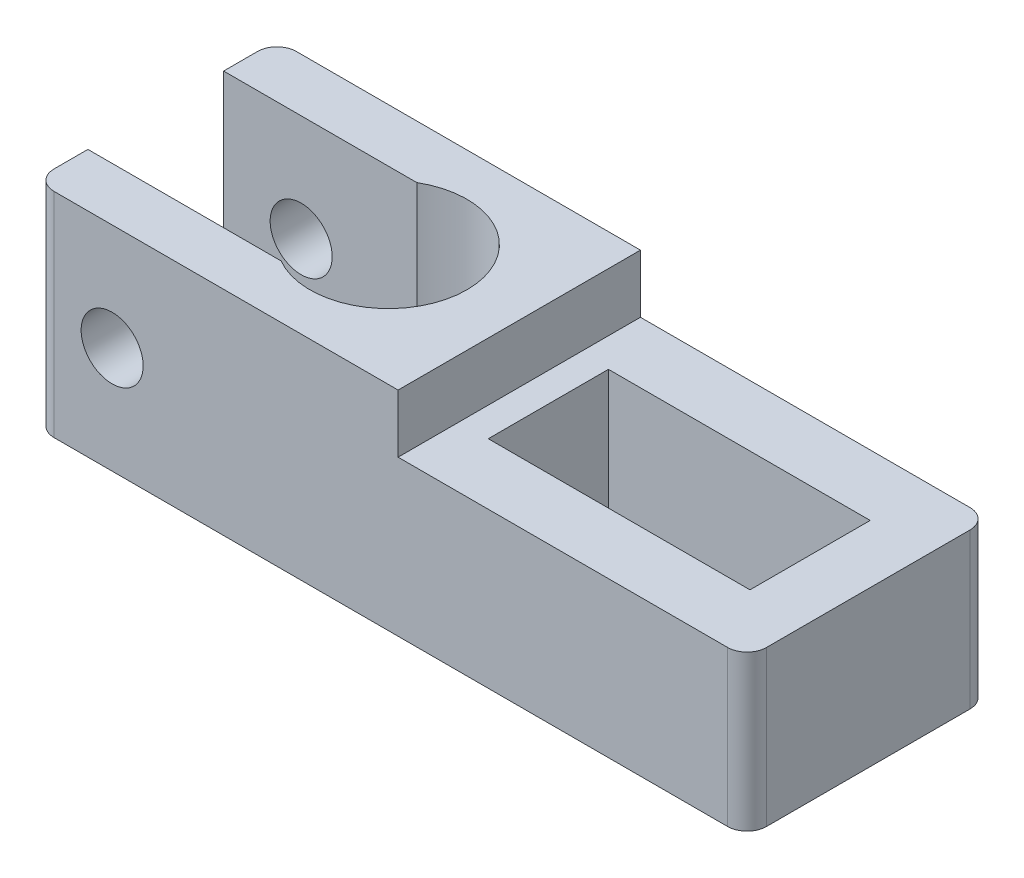
ISO-10303-21;
HEADER;
FILE_DESCRIPTION(('STEP AP214'),'2;1');
FILE_NAME('part.step','',(''),(''),'','','');
FILE_SCHEMA(('AUTOMOTIVE_DESIGN { 1 0 10303 214 1 1 1 1 }'));
ENDSEC;
DATA;
#1=APPLICATION_CONTEXT('core data for automotive mechanical design processes');
#2=APPLICATION_PROTOCOL_DEFINITION('international standard','automotive_design',2000,#1);
#3=PRODUCT_CONTEXT('',#1,'mechanical');
#4=PRODUCT('Part','Part','',(#3));
#5=PRODUCT_RELATED_PRODUCT_CATEGORY('part','',(#4));
#6=PRODUCT_DEFINITION_FORMATION('','',#4);
#7=PRODUCT_DEFINITION_CONTEXT('part definition',#1,'design');
#8=PRODUCT_DEFINITION('design','',#6,#7);
#9=PRODUCT_DEFINITION_SHAPE('','',#8);
#10=(LENGTH_UNIT() NAMED_UNIT(*) SI_UNIT(.MILLI.,.METRE.));
#11=(NAMED_UNIT(*) PLANE_ANGLE_UNIT() SI_UNIT($,.RADIAN.));
#12=(NAMED_UNIT(*) SI_UNIT($,.STERADIAN.) SOLID_ANGLE_UNIT());
#13=UNCERTAINTY_MEASURE_WITH_UNIT(LENGTH_MEASURE(1.E-05),#10,'distance_accuracy_value','');
#14=(GEOMETRIC_REPRESENTATION_CONTEXT(3) GLOBAL_UNCERTAINTY_ASSIGNED_CONTEXT((#13)) GLOBAL_UNIT_ASSIGNED_CONTEXT((#10,
#11,#12)) REPRESENTATION_CONTEXT('',''));
#15=CARTESIAN_POINT('',(0.,0.,0.));
#16=DIRECTION('',(0.,0.,1.));
#17=DIRECTION('',(1.,0.,0.));
#18=AXIS2_PLACEMENT_3D('',#15,#16,#17);
#19=CARTESIAN_POINT('',(0.,11.,3.1));
#20=DIRECTION('',(0.,0.,1.));
#21=DIRECTION('',(1.,0.,0.));
#22=AXIS2_PLACEMENT_3D('',#19,#20,#21);
#23=PLANE('',#22);
#24=DIRECTION('',(0.,-1.,0.));
#25=VECTOR('',#24,1.);
#26=CARTESIAN_POINT('',(8.25,11.,3.1));
#27=LINE('',#26,#25);
#28=CARTESIAN_POINT('',(8.25,8.,3.1));
#29=VERTEX_POINT('',#28);
#30=CARTESIAN_POINT('',(8.25,0.,3.1));
#31=VERTEX_POINT('',#30);
#32=EDGE_CURVE('E237',#29,#31,#27,.T.);
#33=ORIENTED_EDGE('',*,*,#32,.F.);
#34=DIRECTION('',(1.,0.,0.));
#35=VECTOR('',#34,1.);
#36=CARTESIAN_POINT('',(0.,8.,3.1));
#37=LINE('',#36,#35);
#38=CARTESIAN_POINT('',(21.75,8.,3.1));
#39=VERTEX_POINT('',#38);
#40=EDGE_CURVE('E312',#29,#39,#37,.T.);
#41=ORIENTED_EDGE('',*,*,#40,.T.);
#42=DIRECTION('',(0.,-1.,0.));
#43=VECTOR('',#42,1.);
#44=CARTESIAN_POINT('',(21.75,11.,3.1));
#45=LINE('',#44,#43);
#46=CARTESIAN_POINT('',(21.75,0.,3.1));
#47=VERTEX_POINT('',#46);
#48=EDGE_CURVE('E230',#39,#47,#45,.T.);
#49=ORIENTED_EDGE('',*,*,#48,.T.);
#50=DIRECTION('',(-1.,0.,0.));
#51=VECTOR('',#50,1.);
#52=CARTESIAN_POINT('',(0.,0.,3.1));
#53=LINE('',#52,#51);
#54=EDGE_CURVE('E217',#47,#31,#53,.T.);
#55=ORIENTED_EDGE('',*,*,#54,.T.);
#56=EDGE_LOOP('',(#33,#41,#49,#55));
#57=FACE_BOUND('',#56,.T.);
#58=ADVANCED_FACE('F35',(#57),#23,.F.);
#59=CARTESIAN_POINT('',(8.25,11.,0.));
#60=DIRECTION('',(-1.,0.,0.));
#61=DIRECTION('',(0.,0.,1.));
#62=AXIS2_PLACEMENT_3D('',#59,#60,#61);
#63=PLANE('',#62);
#64=DIRECTION('',(0.,-1.,0.));
#65=VECTOR('',#64,1.);
#66=CARTESIAN_POINT('',(8.25,11.,-3.1));
#67=LINE('',#66,#65);
#68=CARTESIAN_POINT('',(8.25,8.,-3.1));
#69=VERTEX_POINT('',#68);
#70=CARTESIAN_POINT('',(8.25,0.,-3.1));
#71=VERTEX_POINT('',#70);
#72=EDGE_CURVE('E235',#69,#71,#67,.T.);
#73=ORIENTED_EDGE('',*,*,#72,.F.);
#74=DIRECTION('',(0.,0.,1.));
#75=VECTOR('',#74,1.);
#76=CARTESIAN_POINT('',(8.25,8.,0.));
#77=LINE('',#76,#75);
#78=EDGE_CURVE('E309',#69,#29,#77,.T.);
#79=ORIENTED_EDGE('',*,*,#78,.T.);
#80=ORIENTED_EDGE('',*,*,#32,.T.);
#81=DIRECTION('',(0.,0.,-1.));
#82=VECTOR('',#81,1.);
#83=CARTESIAN_POINT('',(8.25,0.,0.));
#84=LINE('',#83,#82);
#85=EDGE_CURVE('E220',#31,#71,#84,.T.);
#86=ORIENTED_EDGE('',*,*,#85,.T.);
#87=EDGE_LOOP('',(#73,#79,#80,#86));
#88=FACE_BOUND('',#87,.T.);
#89=ADVANCED_FACE('F364',(#88),#63,.F.);
#90=CARTESIAN_POINT('',(0.,11.,-3.1));
#91=DIRECTION('',(0.,0.,1.));
#92=DIRECTION('',(1.,0.,0.));
#93=AXIS2_PLACEMENT_3D('',#90,#91,#92);
#94=PLANE('',#93);
#95=DIRECTION('',(1.,0.,0.));
#96=VECTOR('',#95,1.);
#97=CARTESIAN_POINT('',(0.,8.,-3.1));
#98=LINE('',#97,#96);
#99=CARTESIAN_POINT('',(21.75,8.,-3.1));
#100=VERTEX_POINT('',#99);
#101=EDGE_CURVE('E50',#69,#100,#98,.T.);
#102=ORIENTED_EDGE('',*,*,#101,.F.);
#103=ORIENTED_EDGE('',*,*,#72,.T.);
#104=DIRECTION('',(-1.,0.,0.));
#105=VECTOR('',#104,1.);
#106=CARTESIAN_POINT('',(0.,0.,-3.1));
#107=LINE('',#106,#105);
#108=CARTESIAN_POINT('',(21.75,0.,-3.1));
#109=VERTEX_POINT('',#108);
#110=EDGE_CURVE('E223',#109,#71,#107,.T.);
#111=ORIENTED_EDGE('',*,*,#110,.F.);
#112=DIRECTION('',(0.,-1.,0.));
#113=VECTOR('',#112,1.);
#114=CARTESIAN_POINT('',(21.75,11.,-3.1));
#115=LINE('',#114,#113);
#116=EDGE_CURVE('E232',#100,#109,#115,.T.);
#117=ORIENTED_EDGE('',*,*,#116,.F.);
#118=EDGE_LOOP('',(#102,#103,#111,#117));
#119=FACE_BOUND('',#118,.T.);
#120=ADVANCED_FACE('F370',(#119),#94,.T.);
#121=CARTESIAN_POINT('',(0.,11.,0.));
#122=DIRECTION('',(0.,-1.,0.));
#123=DIRECTION('',(0.,0.,-1.));
#124=AXIS2_PLACEMENT_3D('',#121,#122,#123);
#125=CYLINDRICAL_SURFACE('',#124,4.05);
#126=CARTESIAN_POINT('',(0.,0.,0.));
#127=DIRECTION('',(0.,1.,0.));
#128=DIRECTION('',(0.,0.,1.));
#129=AXIS2_PLACEMENT_3D('',#126,#127,#128);
#130=CIRCLE('',#129,4.05);
#131=CARTESIAN_POINT('',(-2.03776838723148,0.,3.5));
#132=VERTEX_POINT('',#131);
#133=CARTESIAN_POINT('',(-2.03776838723148,0.,-3.5));
#134=VERTEX_POINT('',#133);
#135=EDGE_CURVE('E196',#132,#134,#130,.T.);
#136=ORIENTED_EDGE('',*,*,#135,.F.);
#137=DIRECTION('',(0.,-1.,0.));
#138=VECTOR('',#137,1.);
#139=CARTESIAN_POINT('',(-2.03776838723148,11.,3.5));
#140=LINE('',#139,#138);
#141=CARTESIAN_POINT('',(-2.03776838723148,11.,3.5));
#142=VERTEX_POINT('',#141);
#143=EDGE_CURVE('E233',#142,#132,#140,.T.);
#144=ORIENTED_EDGE('',*,*,#143,.F.);
#145=CARTESIAN_POINT('',(0.,11.,0.));
#146=DIRECTION('',(0.,1.,0.));
#147=DIRECTION('',(0.,0.,1.));
#148=AXIS2_PLACEMENT_3D('',#145,#146,#147);
#149=CIRCLE('',#148,4.05);
#150=CARTESIAN_POINT('',(-2.03776838723148,11.,-3.5));
#151=VERTEX_POINT('',#150);
#152=EDGE_CURVE('E229',#142,#151,#149,.T.);
#153=ORIENTED_EDGE('',*,*,#152,.T.);
#154=DIRECTION('',(0.,-1.,0.));
#155=VECTOR('',#154,1.);
#156=CARTESIAN_POINT('',(-2.03776838723148,11.,-3.5));
#157=LINE('',#156,#155);
#158=EDGE_CURVE('E195',#151,#134,#157,.T.);
#159=ORIENTED_EDGE('',*,*,#158,.T.);
#160=EDGE_LOOP('',(#136,#144,#153,#159));
#161=FACE_BOUND('',#160,.T.);
#162=ADVANCED_FACE('F342',(#161),#125,.F.);
#163=CARTESIAN_POINT('',(0.,11.,3.5));
#164=DIRECTION('',(0.,0.,1.));
#165=DIRECTION('',(1.,0.,0.));
#166=AXIS2_PLACEMENT_3D('',#163,#164,#165);
#167=PLANE('',#166);
#168=CARTESIAN_POINT('',(-8.,5.5,3.5));
#169=DIRECTION('',(0.,0.,1.));
#170=DIRECTION('',(1.,0.,0.));
#171=AXIS2_PLACEMENT_3D('',#168,#169,#170);
#172=CIRCLE('',#171,1.6);
#173=CARTESIAN_POINT('',(-6.4,5.5,3.5));
#174=VERTEX_POINT('',#173);
#175=EDGE_CURVE('E200',#174,#174,#172,.T.);
#176=ORIENTED_EDGE('',*,*,#175,.T.);
#177=EDGE_LOOP('',(#176));
#178=FACE_BOUND('',#177,.T.);
#179=DIRECTION('',(-1.,0.,0.));
#180=VECTOR('',#179,1.);
#181=CARTESIAN_POINT('',(0.,0.,3.5));
#182=LINE('',#181,#180);
#183=CARTESIAN_POINT('',(-12.,0.,3.5));
#184=VERTEX_POINT('',#183);
#185=EDGE_CURVE('E199',#132,#184,#182,.T.);
#186=ORIENTED_EDGE('',*,*,#185,.T.);
#187=DIRECTION('',(0.,-1.,0.));
#188=VECTOR('',#187,1.);
#189=CARTESIAN_POINT('',(-12.,11.,3.5));
#190=LINE('',#189,#188);
#191=CARTESIAN_POINT('',(-12.,11.,3.5));
#192=VERTEX_POINT('',#191);
#193=EDGE_CURVE('E243',#192,#184,#190,.T.);
#194=ORIENTED_EDGE('',*,*,#193,.F.);
#195=DIRECTION('',(-1.,0.,0.));
#196=VECTOR('',#195,1.);
#197=CARTESIAN_POINT('',(0.,11.,3.5));
#198=LINE('',#197,#196);
#199=EDGE_CURVE('E324',#142,#192,#198,.T.);
#200=ORIENTED_EDGE('',*,*,#199,.F.);
#201=ORIENTED_EDGE('',*,*,#143,.T.);
#202=EDGE_LOOP('',(#186,#194,#200,#201));
#203=FACE_BOUND('',#202,.T.);
#204=ADVANCED_FACE('F337',(#178,#203),#167,.F.);
#205=CARTESIAN_POINT('',(-12.,11.,0.));
#206=DIRECTION('',(-1.,0.,0.));
#207=DIRECTION('',(0.,0.,1.));
#208=AXIS2_PLACEMENT_3D('',#205,#206,#207);
#209=PLANE('',#208);
#210=DIRECTION('',(0.,0.,-1.));
#211=VECTOR('',#210,1.);
#212=CARTESIAN_POINT('',(-12.,0.,0.));
#213=LINE('',#212,#211);
#214=CARTESIAN_POINT('',(-12.,0.,5.25));
#215=VERTEX_POINT('',#214);
#216=EDGE_CURVE('E203',#215,#184,#213,.T.);
#217=ORIENTED_EDGE('',*,*,#216,.F.);
#218=DIRECTION('',(0.,-1.,0.));
#219=VECTOR('',#218,1.);
#220=CARTESIAN_POINT('',(-12.,11.,5.25));
#221=LINE('',#220,#219);
#222=CARTESIAN_POINT('',(-12.,11.,5.25));
#223=VERTEX_POINT('',#222);
#224=EDGE_CURVE('E264',#215,#223,#221,.F.);
#225=ORIENTED_EDGE('',*,*,#224,.T.);
#226=DIRECTION('',(0.,0.,-1.));
#227=VECTOR('',#226,1.);
#228=CARTESIAN_POINT('',(-12.,11.,0.));
#229=LINE('',#228,#227);
#230=EDGE_CURVE('E190',#223,#192,#229,.T.);
#231=ORIENTED_EDGE('',*,*,#230,.T.);
#232=ORIENTED_EDGE('',*,*,#193,.T.);
#233=EDGE_LOOP('',(#217,#225,#231,#232));
#234=FACE_BOUND('',#233,.T.);
#235=ADVANCED_FACE('F329',(#234),#209,.T.);
#236=CARTESIAN_POINT('',(0.,11.,6.25));
#237=DIRECTION('',(0.,0.,1.));
#238=DIRECTION('',(1.,0.,0.));
#239=AXIS2_PLACEMENT_3D('',#236,#237,#238);
#240=PLANE('',#239);
#241=DIRECTION('',(1.,0.,0.));
#242=VECTOR('',#241,1.);
#243=CARTESIAN_POINT('',(24.75,8.,6.25));
#244=LINE('',#243,#242);
#245=CARTESIAN_POINT('',(6.75,8.,6.25));
#246=VERTEX_POINT('',#245);
#247=CARTESIAN_POINT('',(23.75,8.,6.25));
#248=VERTEX_POINT('',#247);
#249=EDGE_CURVE('E170',#246,#248,#244,.T.);
#250=ORIENTED_EDGE('',*,*,#249,.F.);
#251=DIRECTION('',(0.,-1.,0.));
#252=VECTOR('',#251,1.);
#253=CARTESIAN_POINT('',(6.75,11.,6.25));
#254=LINE('',#253,#252);
#255=CARTESIAN_POINT('',(6.75,11.,6.25));
#256=VERTEX_POINT('',#255);
#257=EDGE_CURVE('E299',#256,#246,#254,.T.);
#258=ORIENTED_EDGE('',*,*,#257,.F.);
#259=DIRECTION('',(-1.,0.,0.));
#260=VECTOR('',#259,1.);
#261=CARTESIAN_POINT('',(0.,11.,6.25));
#262=LINE('',#261,#260);
#263=CARTESIAN_POINT('',(-11.,11.,6.25));
#264=VERTEX_POINT('',#263);
#265=EDGE_CURVE('E178',#256,#264,#262,.T.);
#266=ORIENTED_EDGE('',*,*,#265,.T.);
#267=DIRECTION('',(0.,-1.,0.));
#268=VECTOR('',#267,1.);
#269=CARTESIAN_POINT('',(-11.,11.,6.25));
#270=LINE('',#269,#268);
#271=CARTESIAN_POINT('',(-11.,0.,6.25));
#272=VERTEX_POINT('',#271);
#273=EDGE_CURVE('E253',#264,#272,#270,.T.);
#274=ORIENTED_EDGE('',*,*,#273,.T.);
#275=DIRECTION('',(-1.,0.,0.));
#276=VECTOR('',#275,1.);
#277=CARTESIAN_POINT('',(0.,0.,6.25));
#278=LINE('',#277,#276);
#279=CARTESIAN_POINT('',(23.75,0.,6.25));
#280=VERTEX_POINT('',#279);
#281=EDGE_CURVE('E205',#280,#272,#278,.T.);
#282=ORIENTED_EDGE('',*,*,#281,.F.);
#283=DIRECTION('',(0.,-1.,0.));
#284=VECTOR('',#283,1.);
#285=CARTESIAN_POINT('',(23.75,11.,6.25));
#286=LINE('',#285,#284);
#287=EDGE_CURVE('E239',#280,#248,#286,.F.);
#288=ORIENTED_EDGE('',*,*,#287,.T.);
#289=EDGE_LOOP('',(#250,#258,#266,#274,#282,#288));
#290=FACE_BOUND('',#289,.T.);
#291=CARTESIAN_POINT('',(-8.,5.5,6.25));
#292=DIRECTION('',(0.,0.,1.));
#293=DIRECTION('',(1.,0.,0.));
#294=AXIS2_PLACEMENT_3D('',#291,#292,#293);
#295=CIRCLE('',#294,1.6);
#296=CARTESIAN_POINT('',(-6.4,5.5,6.25));
#297=VERTEX_POINT('',#296);
#298=EDGE_CURVE('E315',#297,#297,#295,.T.);
#299=ORIENTED_EDGE('',*,*,#298,.F.);
#300=EDGE_LOOP('',(#299));
#301=FACE_BOUND('',#300,.T.);
#302=ADVANCED_FACE('F387',(#290,#301),#240,.T.);
#303=CARTESIAN_POINT('',(24.75,11.,0.));
#304=DIRECTION('',(-1.,0.,0.));
#305=DIRECTION('',(0.,0.,1.));
#306=AXIS2_PLACEMENT_3D('',#303,#304,#305);
#307=PLANE('',#306);
#308=DIRECTION('',(0.,-1.,0.));
#309=VECTOR('',#308,1.);
#310=CARTESIAN_POINT('',(24.75,11.,-5.25));
#311=LINE('',#310,#309);
#312=CARTESIAN_POINT('',(24.75,0.,-5.25));
#313=VERTEX_POINT('',#312);
#314=CARTESIAN_POINT('',(24.75,8.,-5.25));
#315=VERTEX_POINT('',#314);
#316=EDGE_CURVE('E276',#313,#315,#311,.F.);
#317=ORIENTED_EDGE('',*,*,#316,.T.);
#318=DIRECTION('',(0.,0.,1.));
#319=VECTOR('',#318,1.);
#320=CARTESIAN_POINT('',(24.75,8.,-6.25));
#321=LINE('',#320,#319);
#322=CARTESIAN_POINT('',(24.75,8.,5.25));
#323=VERTEX_POINT('',#322);
#324=EDGE_CURVE('E57',#315,#323,#321,.T.);
#325=ORIENTED_EDGE('',*,*,#324,.T.);
#326=DIRECTION('',(0.,-1.,0.));
#327=VECTOR('',#326,1.);
#328=CARTESIAN_POINT('',(24.75,0.,5.25));
#329=LINE('',#328,#327);
#330=CARTESIAN_POINT('',(24.75,0.,5.25));
#331=VERTEX_POINT('',#330);
#332=EDGE_CURVE('E43',#323,#331,#329,.T.);
#333=ORIENTED_EDGE('',*,*,#332,.T.);
#334=DIRECTION('',(0.,0.,-1.));
#335=VECTOR('',#334,1.);
#336=CARTESIAN_POINT('',(24.75,0.,0.));
#337=LINE('',#336,#335);
#338=EDGE_CURVE('E209',#331,#313,#337,.T.);
#339=ORIENTED_EDGE('',*,*,#338,.T.);
#340=EDGE_LOOP('',(#317,#325,#333,#339));
#341=FACE_BOUND('',#340,.T.);
#342=ADVANCED_FACE('F281',(#341),#307,.F.);
#343=CARTESIAN_POINT('',(0.,11.,-6.25));
#344=DIRECTION('',(0.,0.,1.));
#345=DIRECTION('',(1.,0.,0.));
#346=AXIS2_PLACEMENT_3D('',#343,#344,#345);
#347=PLANE('',#346);
#348=CARTESIAN_POINT('',(-8.,5.5,-6.25));
#349=DIRECTION('',(0.,0.,1.));
#350=DIRECTION('',(1.,0.,0.));
#351=AXIS2_PLACEMENT_3D('',#348,#349,#350);
#352=CIRCLE('',#351,1.6);
#353=CARTESIAN_POINT('',(-6.4,5.5,-6.25));
#354=VERTEX_POINT('',#353);
#355=EDGE_CURVE('E250',#354,#354,#352,.T.);
#356=ORIENTED_EDGE('',*,*,#355,.T.);
#357=EDGE_LOOP('',(#356));
#358=FACE_BOUND('',#357,.T.);
#359=DIRECTION('',(0.,-1.,0.));
#360=VECTOR('',#359,1.);
#361=CARTESIAN_POINT('',(6.75,11.,-6.25));
#362=LINE('',#361,#360);
#363=CARTESIAN_POINT('',(6.75,11.,-6.25));
#364=VERTEX_POINT('',#363);
#365=CARTESIAN_POINT('',(6.75,8.,-6.25));
#366=VERTEX_POINT('',#365);
#367=EDGE_CURVE('E158',#364,#366,#362,.T.);
#368=ORIENTED_EDGE('',*,*,#367,.T.);
#369=DIRECTION('',(1.,0.,0.));
#370=VECTOR('',#369,1.);
#371=CARTESIAN_POINT('',(24.75,8.,-6.25));
#372=LINE('',#371,#370);
#373=CARTESIAN_POINT('',(23.75,8.,-6.25));
#374=VERTEX_POINT('',#373);
#375=EDGE_CURVE('E169',#366,#374,#372,.T.);
#376=ORIENTED_EDGE('',*,*,#375,.T.);
#377=DIRECTION('',(0.,-1.,0.));
#378=VECTOR('',#377,1.);
#379=CARTESIAN_POINT('',(23.75,11.,-6.25));
#380=LINE('',#379,#378);
#381=CARTESIAN_POINT('',(23.75,0.,-6.25));
#382=VERTEX_POINT('',#381);
#383=EDGE_CURVE('E273',#374,#382,#380,.T.);
#384=ORIENTED_EDGE('',*,*,#383,.T.);
#385=DIRECTION('',(-1.,0.,0.));
#386=VECTOR('',#385,1.);
#387=CARTESIAN_POINT('',(0.,0.,-6.25));
#388=LINE('',#387,#386);
#389=CARTESIAN_POINT('',(-11.,0.,-6.25));
#390=VERTEX_POINT('',#389);
#391=EDGE_CURVE('E212',#382,#390,#388,.T.);
#392=ORIENTED_EDGE('',*,*,#391,.T.);
#393=DIRECTION('',(0.,-1.,0.));
#394=VECTOR('',#393,1.);
#395=CARTESIAN_POINT('',(-11.,11.,-6.25));
#396=LINE('',#395,#394);
#397=CARTESIAN_POINT('',(-11.,11.,-6.25));
#398=VERTEX_POINT('',#397);
#399=EDGE_CURVE('E183',#390,#398,#396,.F.);
#400=ORIENTED_EDGE('',*,*,#399,.T.);
#401=DIRECTION('',(-1.,0.,0.));
#402=VECTOR('',#401,1.);
#403=CARTESIAN_POINT('',(0.,11.,-6.25));
#404=LINE('',#403,#402);
#405=EDGE_CURVE('E175',#364,#398,#404,.T.);
#406=ORIENTED_EDGE('',*,*,#405,.F.);
#407=EDGE_LOOP('',(#368,#376,#384,#392,#400,#406));
#408=FACE_BOUND('',#407,.T.);
#409=ADVANCED_FACE('F180',(#358,#408),#347,.F.);
#410=CARTESIAN_POINT('',(-12.,11.,-3.5));
#411=VERTEX_POINT('',#410);
#412=CARTESIAN_POINT('',(-12.,11.,-5.25));
#413=VERTEX_POINT('',#412);
#414=EDGE_CURVE('E185',#411,#413,#229,.T.);
#415=ORIENTED_EDGE('',*,*,#414,.T.);
#416=DIRECTION('',(0.,-1.,0.));
#417=VECTOR('',#416,1.);
#418=CARTESIAN_POINT('',(-12.,0.,-5.25));
#419=LINE('',#418,#417);
#420=CARTESIAN_POINT('',(-12.,0.,-5.25));
#421=VERTEX_POINT('',#420);
#422=EDGE_CURVE('E270',#413,#421,#419,.T.);
#423=ORIENTED_EDGE('',*,*,#422,.T.);
#424=CARTESIAN_POINT('',(-12.,0.,-3.5));
#425=VERTEX_POINT('',#424);
#426=EDGE_CURVE('E206',#425,#421,#213,.T.);
#427=ORIENTED_EDGE('',*,*,#426,.F.);
#428=DIRECTION('',(0.,-1.,0.));
#429=VECTOR('',#428,1.);
#430=CARTESIAN_POINT('',(-12.,11.,-3.5));
#431=LINE('',#430,#429);
#432=EDGE_CURVE('E241',#411,#425,#431,.T.);
#433=ORIENTED_EDGE('',*,*,#432,.F.);
#434=EDGE_LOOP('',(#415,#423,#427,#433));
#435=FACE_BOUND('',#434,.T.);
#436=ADVANCED_FACE('F348',(#435),#209,.T.);
#437=CARTESIAN_POINT('',(0.,11.,-3.5));
#438=DIRECTION('',(0.,0.,1.));
#439=DIRECTION('',(1.,0.,0.));
#440=AXIS2_PLACEMENT_3D('',#437,#438,#439);
#441=PLANE('',#440);
#442=CARTESIAN_POINT('',(-8.,5.5,-3.5));
#443=DIRECTION('',(0.,0.,1.));
#444=DIRECTION('',(1.,0.,0.));
#445=AXIS2_PLACEMENT_3D('',#442,#443,#444);
#446=CIRCLE('',#445,1.6);
#447=CARTESIAN_POINT('',(-6.4,5.5,-3.5));
#448=VERTEX_POINT('',#447);
#449=EDGE_CURVE('E247',#448,#448,#446,.T.);
#450=ORIENTED_EDGE('',*,*,#449,.F.);
#451=EDGE_LOOP('',(#450));
#452=FACE_BOUND('',#451,.T.);
#453=DIRECTION('',(-1.,0.,0.));
#454=VECTOR('',#453,1.);
#455=CARTESIAN_POINT('',(0.,0.,-3.5));
#456=LINE('',#455,#454);
#457=EDGE_CURVE('E214',#134,#425,#456,.T.);
#458=ORIENTED_EDGE('',*,*,#457,.F.);
#459=ORIENTED_EDGE('',*,*,#158,.F.);
#460=DIRECTION('',(-1.,0.,0.));
#461=VECTOR('',#460,1.);
#462=CARTESIAN_POINT('',(0.,11.,-3.5));
#463=LINE('',#462,#461);
#464=EDGE_CURVE('E188',#151,#411,#463,.T.);
#465=ORIENTED_EDGE('',*,*,#464,.T.);
#466=ORIENTED_EDGE('',*,*,#432,.T.);
#467=EDGE_LOOP('',(#458,#459,#465,#466));
#468=FACE_BOUND('',#467,.T.);
#469=ADVANCED_FACE('F344',(#452,#468),#441,.T.);
#470=CARTESIAN_POINT('',(21.75,11.,0.));
#471=DIRECTION('',(-1.,0.,0.));
#472=DIRECTION('',(0.,0.,1.));
#473=AXIS2_PLACEMENT_3D('',#470,#471,#472);
#474=PLANE('',#473);
#475=DIRECTION('',(0.,0.,1.));
#476=VECTOR('',#475,1.);
#477=CARTESIAN_POINT('',(21.75,8.,0.));
#478=LINE('',#477,#476);
#479=EDGE_CURVE('E306',#100,#39,#478,.T.);
#480=ORIENTED_EDGE('',*,*,#479,.F.);
#481=ORIENTED_EDGE('',*,*,#116,.T.);
#482=DIRECTION('',(0.,0.,-1.));
#483=VECTOR('',#482,1.);
#484=CARTESIAN_POINT('',(21.75,0.,0.));
#485=LINE('',#484,#483);
#486=EDGE_CURVE('E226',#47,#109,#485,.T.);
#487=ORIENTED_EDGE('',*,*,#486,.F.);
#488=ORIENTED_EDGE('',*,*,#48,.F.);
#489=EDGE_LOOP('',(#480,#481,#487,#488));
#490=FACE_BOUND('',#489,.T.);
#491=ADVANCED_FACE('F378',(#490),#474,.T.);
#492=CARTESIAN_POINT('',(0.,11.,0.));
#493=DIRECTION('',(0.,1.,0.));
#494=DIRECTION('',(0.,0.,1.));
#495=AXIS2_PLACEMENT_3D('',#492,#493,#494);
#496=PLANE('',#495);
#497=DIRECTION('',(0.,0.,1.));
#498=VECTOR('',#497,1.);
#499=CARTESIAN_POINT('',(6.75,11.,-6.25));
#500=LINE('',#499,#498);
#501=EDGE_CURVE('E162',#364,#256,#500,.T.);
#502=ORIENTED_EDGE('',*,*,#501,.F.);
#503=ORIENTED_EDGE('',*,*,#405,.T.);
#504=CARTESIAN_POINT('',(-11.,11.,-5.25));
#505=DIRECTION('',(0.,1.,0.));
#506=DIRECTION('',(0.,0.,1.));
#507=AXIS2_PLACEMENT_3D('',#504,#505,#506);
#508=CIRCLE('',#507,1.);
#509=EDGE_CURVE('E266',#398,#413,#508,.T.);
#510=ORIENTED_EDGE('',*,*,#509,.T.);
#511=ORIENTED_EDGE('',*,*,#414,.F.);
#512=ORIENTED_EDGE('',*,*,#464,.F.);
#513=ORIENTED_EDGE('',*,*,#152,.F.);
#514=ORIENTED_EDGE('',*,*,#199,.T.);
#515=ORIENTED_EDGE('',*,*,#230,.F.);
#516=CARTESIAN_POINT('',(-11.,11.,5.25));
#517=DIRECTION('',(0.,1.,0.));
#518=DIRECTION('',(0.,0.,1.));
#519=AXIS2_PLACEMENT_3D('',#516,#517,#518);
#520=CIRCLE('',#519,1.);
#521=EDGE_CURVE('E268',#223,#264,#520,.T.);
#522=ORIENTED_EDGE('',*,*,#521,.T.);
#523=ORIENTED_EDGE('',*,*,#265,.F.);
#524=EDGE_LOOP('',(#502,#503,#510,#511,#512,#513,#514,#515,#522,#523));
#525=FACE_BOUND('',#524,.T.);
#526=ADVANCED_FACE('F174',(#525),#496,.T.);
#527=CARTESIAN_POINT('',(0.,0.,0.));
#528=DIRECTION('',(0.,1.,0.));
#529=DIRECTION('',(0.,0.,1.));
#530=AXIS2_PLACEMENT_3D('',#527,#528,#529);
#531=PLANE('',#530);
#532=ORIENTED_EDGE('',*,*,#281,.T.);
#533=CARTESIAN_POINT('',(-11.,0.,5.25));
#534=DIRECTION('',(0.,1.,0.));
#535=DIRECTION('',(0.,0.,1.));
#536=AXIS2_PLACEMENT_3D('',#533,#534,#535);
#537=CIRCLE('',#536,1.);
#538=EDGE_CURVE('E262',#272,#215,#537,.F.);
#539=ORIENTED_EDGE('',*,*,#538,.T.);
#540=ORIENTED_EDGE('',*,*,#216,.T.);
#541=ORIENTED_EDGE('',*,*,#185,.F.);
#542=ORIENTED_EDGE('',*,*,#135,.T.);
#543=ORIENTED_EDGE('',*,*,#457,.T.);
#544=ORIENTED_EDGE('',*,*,#426,.T.);
#545=CARTESIAN_POINT('',(-11.,0.,-5.25));
#546=DIRECTION('',(0.,1.,0.));
#547=DIRECTION('',(0.,0.,1.));
#548=AXIS2_PLACEMENT_3D('',#545,#546,#547);
#549=CIRCLE('',#548,1.);
#550=EDGE_CURVE('E260',#421,#390,#549,.F.);
#551=ORIENTED_EDGE('',*,*,#550,.T.);
#552=ORIENTED_EDGE('',*,*,#391,.F.);
#553=CARTESIAN_POINT('',(23.75,0.,-5.25));
#554=DIRECTION('',(0.,1.,0.));
#555=DIRECTION('',(0.,0.,1.));
#556=AXIS2_PLACEMENT_3D('',#553,#554,#555);
#557=CIRCLE('',#556,1.);
#558=EDGE_CURVE('E256',#382,#313,#557,.F.);
#559=ORIENTED_EDGE('',*,*,#558,.T.);
#560=ORIENTED_EDGE('',*,*,#338,.F.);
#561=CARTESIAN_POINT('',(23.75,0.,5.25));
#562=DIRECTION('',(0.,1.,0.));
#563=DIRECTION('',(0.,0.,1.));
#564=AXIS2_PLACEMENT_3D('',#561,#562,#563);
#565=CIRCLE('',#564,1.);
#566=EDGE_CURVE('E258',#331,#280,#565,.F.);
#567=ORIENTED_EDGE('',*,*,#566,.T.);
#568=EDGE_LOOP('',(#532,#539,#540,#541,#542,#543,#544,#551,#552,#559,#560,#567));
#569=FACE_BOUND('',#568,.T.);
#570=ORIENTED_EDGE('',*,*,#54,.F.);
#571=ORIENTED_EDGE('',*,*,#486,.T.);
#572=ORIENTED_EDGE('',*,*,#110,.T.);
#573=ORIENTED_EDGE('',*,*,#85,.F.);
#574=EDGE_LOOP('',(#570,#571,#572,#573));
#575=FACE_BOUND('',#574,.T.);
#576=ADVANCED_FACE('F290',(#569,#575),#531,.F.);
#577=CARTESIAN_POINT('',(-8.,5.5,-6.25));
#578=DIRECTION('',(0.,0.,1.));
#579=DIRECTION('',(1.,0.,0.));
#580=AXIS2_PLACEMENT_3D('',#577,#578,#579);
#581=CYLINDRICAL_SURFACE('',#580,1.6);
#582=ORIENTED_EDGE('',*,*,#449,.T.);
#583=EDGE_LOOP('',(#582));
#584=FACE_BOUND('',#583,.T.);
#585=ORIENTED_EDGE('',*,*,#355,.F.);
#586=EDGE_LOOP('',(#585));
#587=FACE_BOUND('',#586,.T.);
#588=ADVANCED_FACE('F407',(#584,#587),#581,.F.);
#589=ORIENTED_EDGE('',*,*,#298,.T.);
#590=EDGE_LOOP('',(#589));
#591=FACE_BOUND('',#590,.T.);
#592=ORIENTED_EDGE('',*,*,#175,.F.);
#593=EDGE_LOOP('',(#592));
#594=FACE_BOUND('',#593,.T.);
#595=ADVANCED_FACE('F360',(#591,#594),#581,.F.);
#596=CARTESIAN_POINT('',(-11.,11.,5.25));
#597=DIRECTION('',(0.,-1.,0.));
#598=DIRECTION('',(0.,0.,-1.));
#599=AXIS2_PLACEMENT_3D('',#596,#597,#598);
#600=CYLINDRICAL_SURFACE('',#599,1.);
#601=ORIENTED_EDGE('',*,*,#521,.F.);
#602=ORIENTED_EDGE('',*,*,#224,.F.);
#603=ORIENTED_EDGE('',*,*,#538,.F.);
#604=ORIENTED_EDGE('',*,*,#273,.F.);
#605=EDGE_LOOP('',(#601,#602,#603,#604));
#606=FACE_BOUND('',#605,.T.);
#607=ADVANCED_FACE('F354',(#606),#600,.T.);
#608=CARTESIAN_POINT('',(-11.,11.,-5.25));
#609=DIRECTION('',(0.,1.,0.));
#610=DIRECTION('',(0.,0.,1.));
#611=AXIS2_PLACEMENT_3D('',#608,#609,#610);
#612=CYLINDRICAL_SURFACE('',#611,1.);
#613=ORIENTED_EDGE('',*,*,#509,.F.);
#614=ORIENTED_EDGE('',*,*,#399,.F.);
#615=ORIENTED_EDGE('',*,*,#550,.F.);
#616=ORIENTED_EDGE('',*,*,#422,.F.);
#617=EDGE_LOOP('',(#613,#614,#615,#616));
#618=FACE_BOUND('',#617,.T.);
#619=ADVANCED_FACE('F352',(#618),#612,.T.);
#620=CARTESIAN_POINT('',(23.75,11.,5.25));
#621=DIRECTION('',(0.,1.,0.));
#622=DIRECTION('',(0.,0.,1.));
#623=AXIS2_PLACEMENT_3D('',#620,#621,#622);
#624=CYLINDRICAL_SURFACE('',#623,1.);
#625=CARTESIAN_POINT('',(23.75,8.,5.25));
#626=DIRECTION('',(0.,-1.,0.));
#627=DIRECTION('',(1.,0.,0.));
#628=AXIS2_PLACEMENT_3D('',#625,#626,#627);
#629=CIRCLE('',#628,1.);
#630=EDGE_CURVE('E303',#248,#323,#629,.F.);
#631=ORIENTED_EDGE('',*,*,#630,.F.);
#632=ORIENTED_EDGE('',*,*,#287,.F.);
#633=ORIENTED_EDGE('',*,*,#566,.F.);
#634=ORIENTED_EDGE('',*,*,#332,.F.);
#635=EDGE_LOOP('',(#631,#632,#633,#634));
#636=FACE_BOUND('',#635,.T.);
#637=ADVANCED_FACE('F287',(#636),#624,.T.);
#638=CARTESIAN_POINT('',(23.75,11.,-5.25));
#639=DIRECTION('',(0.,-1.,0.));
#640=DIRECTION('',(0.,0.,-1.));
#641=AXIS2_PLACEMENT_3D('',#638,#639,#640);
#642=CYLINDRICAL_SURFACE('',#641,1.);
#643=CARTESIAN_POINT('',(23.75,8.,-5.25));
#644=DIRECTION('',(0.,-1.,0.));
#645=DIRECTION('',(1.,0.,0.));
#646=AXIS2_PLACEMENT_3D('',#643,#644,#645);
#647=CIRCLE('',#646,1.);
#648=EDGE_CURVE('E11',#315,#374,#647,.F.);
#649=ORIENTED_EDGE('',*,*,#648,.F.);
#650=ORIENTED_EDGE('',*,*,#316,.F.);
#651=ORIENTED_EDGE('',*,*,#558,.F.);
#652=ORIENTED_EDGE('',*,*,#383,.F.);
#653=EDGE_LOOP('',(#649,#650,#651,#652));
#654=FACE_BOUND('',#653,.T.);
#655=ADVANCED_FACE('F37',(#654),#642,.T.);
#656=CARTESIAN_POINT('',(24.75,8.,-6.25));
#657=DIRECTION('',(0.,-1.,0.));
#658=DIRECTION('',(1.,0.,0.));
#659=AXIS2_PLACEMENT_3D('',#656,#657,#658);
#660=PLANE('',#659);
#661=ORIENTED_EDGE('',*,*,#630,.T.);
#662=ORIENTED_EDGE('',*,*,#324,.F.);
#663=ORIENTED_EDGE('',*,*,#648,.T.);
#664=ORIENTED_EDGE('',*,*,#375,.F.);
#665=DIRECTION('',(0.,0.,1.));
#666=VECTOR('',#665,1.);
#667=CARTESIAN_POINT('',(6.75,8.,-6.25));
#668=LINE('',#667,#666);
#669=EDGE_CURVE('E164',#366,#246,#668,.T.);
#670=ORIENTED_EDGE('',*,*,#669,.T.);
#671=ORIENTED_EDGE('',*,*,#249,.T.);
#672=EDGE_LOOP('',(#661,#662,#663,#664,#670,#671));
#673=FACE_BOUND('',#672,.T.);
#674=ORIENTED_EDGE('',*,*,#78,.F.);
#675=ORIENTED_EDGE('',*,*,#101,.T.);
#676=ORIENTED_EDGE('',*,*,#479,.T.);
#677=ORIENTED_EDGE('',*,*,#40,.F.);
#678=EDGE_LOOP('',(#674,#675,#676,#677));
#679=FACE_BOUND('',#678,.T.);
#680=ADVANCED_FACE('F296',(#673,#679),#660,.F.);
#681=CARTESIAN_POINT('',(6.75,11.,-6.25));
#682=DIRECTION('',(-1.,0.,0.));
#683=DIRECTION('',(0.,0.,1.));
#684=AXIS2_PLACEMENT_3D('',#681,#682,#683);
#685=PLANE('',#684);
#686=ORIENTED_EDGE('',*,*,#257,.T.);
#687=ORIENTED_EDGE('',*,*,#669,.F.);
#688=ORIENTED_EDGE('',*,*,#367,.F.);
#689=ORIENTED_EDGE('',*,*,#501,.T.);
#690=EDGE_LOOP('',(#686,#687,#688,#689));
#691=FACE_BOUND('',#690,.T.);
#692=ADVANCED_FACE('F161',(#691),#685,.F.);
#693=CLOSED_SHELL('',(#58,#89,#120,#162,#204,#235,#302,#342,#409,#436,#469,#491,#526,#576,#588,
#595,#607,#619,#637,#655,#680,#692));
#694=MANIFOLD_SOLID_BREP('B2',#693);
#695=ADVANCED_BREP_SHAPE_REPRESENTATION('',(#18,#694),#14);
#696=SHAPE_DEFINITION_REPRESENTATION(#9,#695);
ENDSEC;
END-ISO-10303-21;
